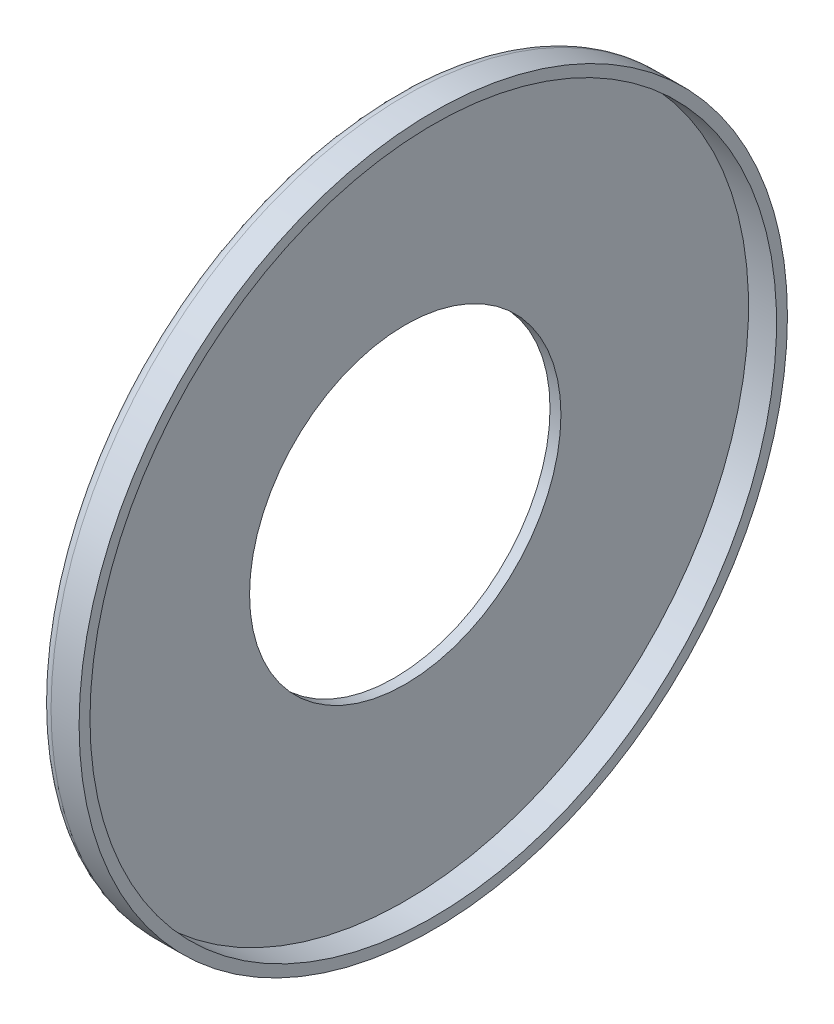
ISO-10303-21;
HEADER;
FILE_DESCRIPTION(('STEP AP214'),'2;1');
FILE_NAME('part.step','',(''),(''),'','','');
FILE_SCHEMA(('AUTOMOTIVE_DESIGN { 1 0 10303 214 1 1 1 1 }'));
ENDSEC;
DATA;
#1=APPLICATION_CONTEXT('core data for automotive mechanical design processes');
#2=APPLICATION_PROTOCOL_DEFINITION('international standard','automotive_design',2000,#1);
#3=PRODUCT_CONTEXT('',#1,'mechanical');
#4=PRODUCT('Part','Part','',(#3));
#5=PRODUCT_RELATED_PRODUCT_CATEGORY('part','',(#4));
#6=PRODUCT_DEFINITION_FORMATION('','',#4);
#7=PRODUCT_DEFINITION_CONTEXT('part definition',#1,'design');
#8=PRODUCT_DEFINITION('design','',#6,#7);
#9=PRODUCT_DEFINITION_SHAPE('','',#8);
#10=(LENGTH_UNIT() NAMED_UNIT(*) SI_UNIT(.MILLI.,.METRE.));
#11=(NAMED_UNIT(*) PLANE_ANGLE_UNIT() SI_UNIT($,.RADIAN.));
#12=(NAMED_UNIT(*) SI_UNIT($,.STERADIAN.) SOLID_ANGLE_UNIT());
#13=UNCERTAINTY_MEASURE_WITH_UNIT(LENGTH_MEASURE(1.E-05),#10,'distance_accuracy_value','');
#14=(GEOMETRIC_REPRESENTATION_CONTEXT(3) GLOBAL_UNCERTAINTY_ASSIGNED_CONTEXT((#13)) GLOBAL_UNIT_ASSIGNED_CONTEXT((#10,
#11,#12)) REPRESENTATION_CONTEXT('',''));
#15=CARTESIAN_POINT('',(0.,0.,0.));
#16=DIRECTION('',(0.,0.,1.));
#17=DIRECTION('',(1.,0.,0.));
#18=AXIS2_PLACEMENT_3D('',#15,#16,#17);
#19=CARTESIAN_POINT('',(0.,0.,0.));
#20=DIRECTION('',(-1.,0.,0.));
#21=DIRECTION('',(0.,0.,1.));
#22=AXIS2_PLACEMENT_3D('',#19,#20,#21);
#23=CYLINDRICAL_SURFACE('',#22,10.);
#24=CARTESIAN_POINT('',(0.700000000000006,0.,0.));
#25=DIRECTION('',(-1.,0.,0.));
#26=DIRECTION('',(0.,0.,1.));
#27=AXIS2_PLACEMENT_3D('',#24,#25,#26);
#28=CIRCLE('',#27,10.);
#29=CARTESIAN_POINT('',(0.700000000000006,0.,10.));
#30=VERTEX_POINT('',#29);
#31=EDGE_CURVE('E12',#30,#30,#28,.T.);
#32=ORIENTED_EDGE('',*,*,#31,.F.);
#33=EDGE_LOOP('',(#32));
#34=FACE_BOUND('',#33,.T.);
#35=CARTESIAN_POINT('',(0.,0.,0.));
#36=DIRECTION('',(-1.,0.,0.));
#37=DIRECTION('',(0.,0.,1.));
#38=AXIS2_PLACEMENT_3D('',#35,#36,#37);
#39=CIRCLE('',#38,10.);
#40=CARTESIAN_POINT('',(0.,0.,10.));
#41=VERTEX_POINT('',#40);
#42=EDGE_CURVE('E70',#41,#41,#39,.T.);
#43=ORIENTED_EDGE('',*,*,#42,.T.);
#44=EDGE_LOOP('',(#43));
#45=FACE_BOUND('',#44,.T.);
#46=ADVANCED_FACE('F45',(#34,#45),#23,.F.);
#47=CARTESIAN_POINT('',(0.700000000000006,10.,0.));
#48=DIRECTION('',(-1.,0.,0.));
#49=DIRECTION('',(0.,0.,1.));
#50=AXIS2_PLACEMENT_3D('',#47,#48,#49);
#51=PLANE('',#50);
#52=CARTESIAN_POINT('',(0.700000000000006,0.,0.));
#53=DIRECTION('',(-1.,0.,0.));
#54=DIRECTION('',(0.,0.,1.));
#55=AXIS2_PLACEMENT_3D('',#52,#53,#54);
#56=CIRCLE('',#55,22.05);
#57=CARTESIAN_POINT('',(0.700000000000006,0.,22.05));
#58=VERTEX_POINT('',#57);
#59=EDGE_CURVE('E51',#58,#58,#56,.T.);
#60=ORIENTED_EDGE('',*,*,#59,.F.);
#61=EDGE_LOOP('',(#60));
#62=FACE_BOUND('',#61,.T.);
#63=ORIENTED_EDGE('',*,*,#31,.T.);
#64=EDGE_LOOP('',(#63));
#65=FACE_BOUND('',#64,.T.);
#66=ADVANCED_FACE('F101',(#62,#65),#51,.F.);
#67=CARTESIAN_POINT('',(0.,0.,0.));
#68=DIRECTION('',(-1.,0.,0.));
#69=DIRECTION('',(0.,0.,1.));
#70=AXIS2_PLACEMENT_3D('',#67,#68,#69);
#71=CYLINDRICAL_SURFACE('',#70,22.05);
#72=CARTESIAN_POINT('',(2.5,0.,0.));
#73=DIRECTION('',(-1.,0.,0.));
#74=DIRECTION('',(0.,0.,1.));
#75=AXIS2_PLACEMENT_3D('',#72,#73,#74);
#76=CIRCLE('',#75,22.05);
#77=CARTESIAN_POINT('',(2.5,0.,22.05));
#78=VERTEX_POINT('',#77);
#79=EDGE_CURVE('E55',#78,#78,#76,.T.);
#80=ORIENTED_EDGE('',*,*,#79,.F.);
#81=EDGE_LOOP('',(#80));
#82=FACE_BOUND('',#81,.T.);
#83=ORIENTED_EDGE('',*,*,#59,.T.);
#84=EDGE_LOOP('',(#83));
#85=FACE_BOUND('',#84,.T.);
#86=ADVANCED_FACE('F96',(#82,#85),#71,.F.);
#87=CARTESIAN_POINT('',(2.5,22.05,0.));
#88=DIRECTION('',(-1.,0.,0.));
#89=DIRECTION('',(0.,0.,1.));
#90=AXIS2_PLACEMENT_3D('',#87,#88,#89);
#91=PLANE('',#90);
#92=CARTESIAN_POINT('',(2.5,0.,0.));
#93=DIRECTION('',(-1.,0.,0.));
#94=DIRECTION('',(0.,0.,1.));
#95=AXIS2_PLACEMENT_3D('',#92,#93,#94);
#96=CIRCLE('',#95,22.75);
#97=CARTESIAN_POINT('',(2.5,0.,22.75));
#98=VERTEX_POINT('',#97);
#99=EDGE_CURVE('E59',#98,#98,#96,.T.);
#100=ORIENTED_EDGE('',*,*,#99,.F.);
#101=EDGE_LOOP('',(#100));
#102=FACE_BOUND('',#101,.T.);
#103=ORIENTED_EDGE('',*,*,#79,.T.);
#104=EDGE_LOOP('',(#103));
#105=FACE_BOUND('',#104,.T.);
#106=ADVANCED_FACE('F90',(#102,#105),#91,.F.);
#107=CARTESIAN_POINT('',(0.,0.,0.));
#108=DIRECTION('',(-1.,0.,0.));
#109=DIRECTION('',(0.,0.,1.));
#110=AXIS2_PLACEMENT_3D('',#107,#108,#109);
#111=CYLINDRICAL_SURFACE('',#110,22.75);
#112=CARTESIAN_POINT('',(0.700000000000006,0.,0.));
#113=DIRECTION('',(-1.,0.,0.));
#114=DIRECTION('',(0.,0.,1.));
#115=AXIS2_PLACEMENT_3D('',#112,#113,#114);
#116=CIRCLE('',#115,22.75);
#117=CARTESIAN_POINT('',(0.700000000000006,0.,22.75));
#118=VERTEX_POINT('',#117);
#119=EDGE_CURVE('E64',#118,#118,#116,.T.);
#120=ORIENTED_EDGE('',*,*,#119,.F.);
#121=EDGE_LOOP('',(#120));
#122=FACE_BOUND('',#121,.T.);
#123=ORIENTED_EDGE('',*,*,#99,.T.);
#124=EDGE_LOOP('',(#123));
#125=FACE_BOUND('',#124,.T.);
#126=ADVANCED_FACE('F84',(#122,#125),#111,.T.);
#127=CARTESIAN_POINT('',(0.700000000000006,0.,0.));
#128=DIRECTION('',(-1.,0.,0.));
#129=DIRECTION('',(0.,0.,1.));
#130=AXIS2_PLACEMENT_3D('',#127,#128,#129);
#131=TOROIDAL_SURFACE('',#130,22.05,0.7);
#132=CARTESIAN_POINT('',(0.,0.,0.));
#133=DIRECTION('',(-1.,0.,0.));
#134=DIRECTION('',(0.,0.,1.));
#135=AXIS2_PLACEMENT_3D('',#132,#133,#134);
#136=CIRCLE('',#135,22.05);
#137=CARTESIAN_POINT('',(0.,0.,22.05));
#138=VERTEX_POINT('',#137);
#139=EDGE_CURVE('E67',#138,#138,#136,.T.);
#140=ORIENTED_EDGE('',*,*,#139,.F.);
#141=EDGE_LOOP('',(#140));
#142=FACE_BOUND('',#141,.T.);
#143=ORIENTED_EDGE('',*,*,#119,.T.);
#144=EDGE_LOOP('',(#143));
#145=FACE_BOUND('',#144,.T.);
#146=ADVANCED_FACE('F78',(#142,#145),#131,.T.);
#147=CARTESIAN_POINT('',(0.,10.,0.));
#148=DIRECTION('',(1.,0.,0.));
#149=DIRECTION('',(0.,0.,-1.));
#150=AXIS2_PLACEMENT_3D('',#147,#148,#149);
#151=PLANE('',#150);
#152=ORIENTED_EDGE('',*,*,#42,.F.);
#153=EDGE_LOOP('',(#152));
#154=FACE_BOUND('',#153,.T.);
#155=ORIENTED_EDGE('',*,*,#139,.T.);
#156=EDGE_LOOP('',(#155));
#157=FACE_BOUND('',#156,.T.);
#158=ADVANCED_FACE('F75',(#154,#157),#151,.F.);
#159=CLOSED_SHELL('',(#46,#66,#86,#106,#126,#146,#158));
#160=MANIFOLD_SOLID_BREP('B2',#159);
#161=ADVANCED_BREP_SHAPE_REPRESENTATION('',(#18,#160),#14);
#162=SHAPE_DEFINITION_REPRESENTATION(#9,#161);
ENDSEC;
END-ISO-10303-21;
